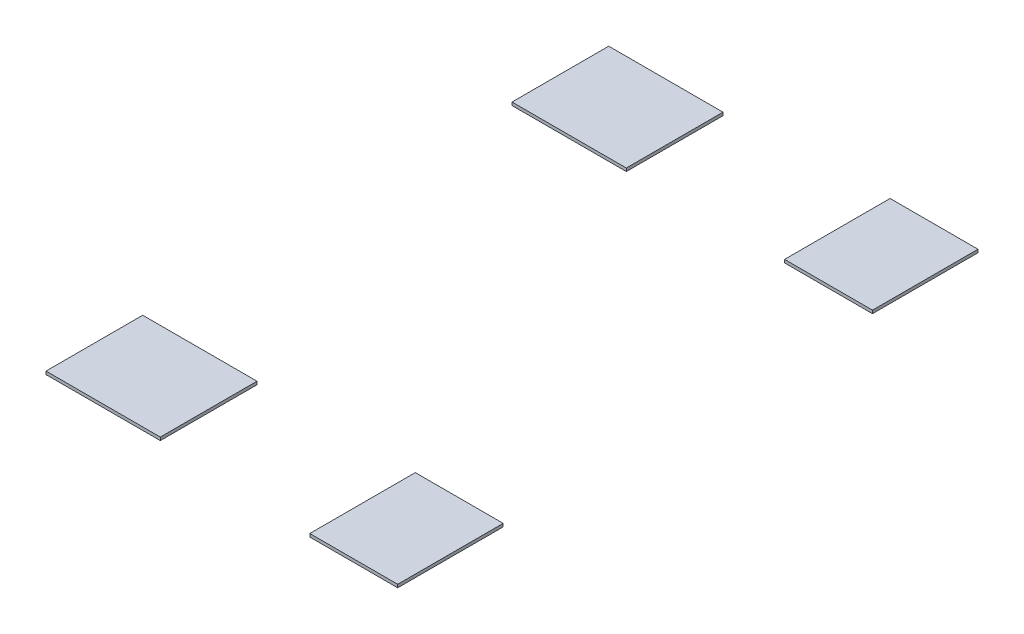
ISO-10303-21;
HEADER;
FILE_DESCRIPTION(('STEP AP214'),'2;1');
FILE_NAME('part.step','',(''),(''),'','','');
FILE_SCHEMA(('AUTOMOTIVE_DESIGN { 1 0 10303 214 1 1 1 1 }'));
ENDSEC;
DATA;
#1=APPLICATION_CONTEXT('core data for automotive mechanical design processes');
#2=APPLICATION_PROTOCOL_DEFINITION('international standard','automotive_design',2000,#1);
#3=PRODUCT_CONTEXT('',#1,'mechanical');
#4=PRODUCT('Part','Part','',(#3));
#5=PRODUCT_RELATED_PRODUCT_CATEGORY('part','',(#4));
#6=PRODUCT_DEFINITION_FORMATION('','',#4);
#7=PRODUCT_DEFINITION_CONTEXT('part definition',#1,'design');
#8=PRODUCT_DEFINITION('design','',#6,#7);
#9=PRODUCT_DEFINITION_SHAPE('','',#8);
#10=(LENGTH_UNIT() NAMED_UNIT(*) SI_UNIT(.MILLI.,.METRE.));
#11=(NAMED_UNIT(*) PLANE_ANGLE_UNIT() SI_UNIT($,.RADIAN.));
#12=(NAMED_UNIT(*) SI_UNIT($,.STERADIAN.) SOLID_ANGLE_UNIT());
#13=UNCERTAINTY_MEASURE_WITH_UNIT(LENGTH_MEASURE(1.E-05),#10,'distance_accuracy_value','');
#14=(GEOMETRIC_REPRESENTATION_CONTEXT(3) GLOBAL_UNCERTAINTY_ASSIGNED_CONTEXT((#13)) GLOBAL_UNIT_ASSIGNED_CONTEXT((#10,
#11,#12)) REPRESENTATION_CONTEXT('',''));
#15=CARTESIAN_POINT('',(0.,0.,0.));
#16=DIRECTION('',(0.,0.,1.));
#17=DIRECTION('',(1.,0.,0.));
#18=AXIS2_PLACEMENT_3D('',#15,#16,#17);
#19=CARTESIAN_POINT('',(-0.35,0.035,2.1));
#20=DIRECTION('',(-1.,0.,0.));
#21=DIRECTION('',(0.,0.,1.));
#22=AXIS2_PLACEMENT_3D('',#19,#20,#21);
#23=PLANE('',#22);
#24=DIRECTION('',(0.,0.,-1.));
#25=VECTOR('',#24,1.);
#26=CARTESIAN_POINT('',(-0.35,0.,2.1));
#27=LINE('',#26,#25);
#28=CARTESIAN_POINT('',(-0.35,0.,3.2));
#29=VERTEX_POINT('',#28);
#30=CARTESIAN_POINT('',(-0.35,0.,2.1));
#31=VERTEX_POINT('',#30);
#32=EDGE_CURVE('E106',#29,#31,#27,.T.);
#33=ORIENTED_EDGE('',*,*,#32,.T.);
#34=DIRECTION('',(0.,-1.,0.));
#35=VECTOR('',#34,1.);
#36=CARTESIAN_POINT('',(-0.35,0.035,2.1));
#37=LINE('',#36,#35);
#38=CARTESIAN_POINT('',(-0.35,0.035,2.1));
#39=VERTEX_POINT('',#38);
#40=EDGE_CURVE('E12',#39,#31,#37,.T.);
#41=ORIENTED_EDGE('',*,*,#40,.F.);
#42=DIRECTION('',(0.,0.,-1.));
#43=VECTOR('',#42,1.);
#44=CARTESIAN_POINT('',(-0.35,0.035,2.1));
#45=LINE('',#44,#43);
#46=CARTESIAN_POINT('',(-0.35,0.035,3.2));
#47=VERTEX_POINT('',#46);
#48=EDGE_CURVE('E94',#47,#39,#45,.T.);
#49=ORIENTED_EDGE('',*,*,#48,.F.);
#50=DIRECTION('',(0.,-1.,0.));
#51=VECTOR('',#50,1.);
#52=CARTESIAN_POINT('',(-0.35,0.035,3.2));
#53=LINE('',#52,#51);
#54=EDGE_CURVE('E102',#47,#29,#53,.T.);
#55=ORIENTED_EDGE('',*,*,#54,.T.);
#56=EDGE_LOOP('',(#33,#41,#49,#55));
#57=FACE_BOUND('',#56,.T.);
#58=ADVANCED_FACE('F43',(#57),#23,.F.);
#59=CARTESIAN_POINT('',(-0.35,0.035,2.1));
#60=DIRECTION('',(0.,0.,1.));
#61=DIRECTION('',(1.,0.,0.));
#62=AXIS2_PLACEMENT_3D('',#59,#60,#61);
#63=PLANE('',#62);
#64=DIRECTION('',(-1.,0.,0.));
#65=VECTOR('',#64,1.);
#66=CARTESIAN_POINT('',(-0.35,0.,2.1));
#67=LINE('',#66,#65);
#68=CARTESIAN_POINT('',(-1.65,0.,2.1));
#69=VERTEX_POINT('',#68);
#70=EDGE_CURVE('E98',#31,#69,#67,.T.);
#71=ORIENTED_EDGE('',*,*,#70,.T.);
#72=DIRECTION('',(0.,-1.,0.));
#73=VECTOR('',#72,1.);
#74=CARTESIAN_POINT('',(-1.65,0.035,2.1));
#75=LINE('',#74,#73);
#76=CARTESIAN_POINT('',(-1.65,0.035,2.1));
#77=VERTEX_POINT('',#76);
#78=EDGE_CURVE('E51',#77,#69,#75,.T.);
#79=ORIENTED_EDGE('',*,*,#78,.F.);
#80=DIRECTION('',(-1.,0.,0.));
#81=VECTOR('',#80,1.);
#82=CARTESIAN_POINT('',(-0.35,0.035,2.1));
#83=LINE('',#82,#81);
#84=EDGE_CURVE('E89',#39,#77,#83,.T.);
#85=ORIENTED_EDGE('',*,*,#84,.F.);
#86=ORIENTED_EDGE('',*,*,#40,.T.);
#87=EDGE_LOOP('',(#71,#79,#85,#86));
#88=FACE_BOUND('',#87,.T.);
#89=ADVANCED_FACE('F97',(#88),#63,.F.);
#90=CARTESIAN_POINT('',(-1.65,0.035,2.1));
#91=DIRECTION('',(1.,0.,0.));
#92=DIRECTION('',(0.,0.,-1.));
#93=AXIS2_PLACEMENT_3D('',#90,#91,#92);
#94=PLANE('',#93);
#95=DIRECTION('',(0.,0.,1.));
#96=VECTOR('',#95,1.);
#97=CARTESIAN_POINT('',(-1.65,0.,2.1));
#98=LINE('',#97,#96);
#99=CARTESIAN_POINT('',(-1.65,0.,3.2));
#100=VERTEX_POINT('',#99);
#101=EDGE_CURVE('E76',#69,#100,#98,.T.);
#102=ORIENTED_EDGE('',*,*,#101,.T.);
#103=DIRECTION('',(0.,-1.,0.));
#104=VECTOR('',#103,1.);
#105=CARTESIAN_POINT('',(-1.65,0.035,3.2));
#106=LINE('',#105,#104);
#107=CARTESIAN_POINT('',(-1.65,0.035,3.2));
#108=VERTEX_POINT('',#107);
#109=EDGE_CURVE('E99',#108,#100,#106,.T.);
#110=ORIENTED_EDGE('',*,*,#109,.F.);
#111=DIRECTION('',(0.,0.,1.));
#112=VECTOR('',#111,1.);
#113=CARTESIAN_POINT('',(-1.65,0.035,2.1));
#114=LINE('',#113,#112);
#115=EDGE_CURVE('E92',#77,#108,#114,.T.);
#116=ORIENTED_EDGE('',*,*,#115,.F.);
#117=ORIENTED_EDGE('',*,*,#78,.T.);
#118=EDGE_LOOP('',(#102,#110,#116,#117));
#119=FACE_BOUND('',#118,.T.);
#120=ADVANCED_FACE('F100',(#119),#94,.F.);
#121=CARTESIAN_POINT('',(-0.35,0.035,3.2));
#122=DIRECTION('',(0.,0.,-1.));
#123=DIRECTION('',(-1.,0.,0.));
#124=AXIS2_PLACEMENT_3D('',#121,#122,#123);
#125=PLANE('',#124);
#126=DIRECTION('',(1.,0.,0.));
#127=VECTOR('',#126,1.);
#128=CARTESIAN_POINT('',(-0.35,0.,3.2));
#129=LINE('',#128,#127);
#130=EDGE_CURVE('E82',#100,#29,#129,.T.);
#131=ORIENTED_EDGE('',*,*,#130,.T.);
#132=ORIENTED_EDGE('',*,*,#54,.F.);
#133=DIRECTION('',(1.,0.,0.));
#134=VECTOR('',#133,1.);
#135=CARTESIAN_POINT('',(-0.35,0.035,3.2));
#136=LINE('',#135,#134);
#137=EDGE_CURVE('E59',#108,#47,#136,.T.);
#138=ORIENTED_EDGE('',*,*,#137,.F.);
#139=ORIENTED_EDGE('',*,*,#109,.T.);
#140=EDGE_LOOP('',(#131,#132,#138,#139));
#141=FACE_BOUND('',#140,.T.);
#142=ADVANCED_FACE('F113',(#141),#125,.F.);
#143=CARTESIAN_POINT('',(0.,0.035,0.));
#144=DIRECTION('',(0.,-1.,0.));
#145=DIRECTION('',(0.,0.,-1.));
#146=AXIS2_PLACEMENT_3D('',#143,#144,#145);
#147=PLANE('',#146);
#148=ORIENTED_EDGE('',*,*,#48,.T.);
#149=ORIENTED_EDGE('',*,*,#84,.T.);
#150=ORIENTED_EDGE('',*,*,#115,.T.);
#151=ORIENTED_EDGE('',*,*,#137,.T.);
#152=EDGE_LOOP('',(#148,#149,#150,#151));
#153=FACE_BOUND('',#152,.T.);
#154=ADVANCED_FACE('F90',(#153),#147,.F.);
#155=CARTESIAN_POINT('',(0.,0.,0.));
#156=DIRECTION('',(0.,-1.,0.));
#157=DIRECTION('',(0.,0.,-1.));
#158=AXIS2_PLACEMENT_3D('',#155,#156,#157);
#159=PLANE('',#158);
#160=ORIENTED_EDGE('',*,*,#32,.F.);
#161=ORIENTED_EDGE('',*,*,#130,.F.);
#162=ORIENTED_EDGE('',*,*,#101,.F.);
#163=ORIENTED_EDGE('',*,*,#70,.F.);
#164=EDGE_LOOP('',(#160,#161,#162,#163));
#165=FACE_BOUND('',#164,.T.);
#166=ADVANCED_FACE('F116',(#165),#159,.T.);
#167=CLOSED_SHELL('',(#58,#89,#120,#142,#154,#166));
#168=MANIFOLD_SOLID_BREP('B2',#167);
#169=CARTESIAN_POINT('',(1.45,0.035,3.3));
#170=DIRECTION('',(0.,0.,-1.));
#171=DIRECTION('',(-1.,0.,0.));
#172=AXIS2_PLACEMENT_3D('',#169,#170,#171);
#173=PLANE('',#172);
#174=DIRECTION('',(1.,0.,0.));
#175=VECTOR('',#174,1.);
#176=CARTESIAN_POINT('',(1.45,0.,3.3));
#177=LINE('',#176,#175);
#178=CARTESIAN_POINT('',(1.45,0.,3.3));
#179=VERTEX_POINT('',#178);
#180=CARTESIAN_POINT('',(2.45,0.,3.3));
#181=VERTEX_POINT('',#180);
#182=EDGE_CURVE('E239',#179,#181,#177,.T.);
#183=ORIENTED_EDGE('',*,*,#182,.T.);
#184=DIRECTION('',(0.,-1.,0.));
#185=VECTOR('',#184,1.);
#186=CARTESIAN_POINT('',(2.45,0.035,3.3));
#187=LINE('',#186,#185);
#188=CARTESIAN_POINT('',(2.45,0.035,3.3));
#189=VERTEX_POINT('',#188);
#190=EDGE_CURVE('E41',#189,#181,#187,.T.);
#191=ORIENTED_EDGE('',*,*,#190,.F.);
#192=DIRECTION('',(1.,0.,0.));
#193=VECTOR('',#192,1.);
#194=CARTESIAN_POINT('',(1.45,0.035,3.3));
#195=LINE('',#194,#193);
#196=CARTESIAN_POINT('',(1.45,0.035,3.3));
#197=VERTEX_POINT('',#196);
#198=EDGE_CURVE('E227',#197,#189,#195,.T.);
#199=ORIENTED_EDGE('',*,*,#198,.F.);
#200=DIRECTION('',(0.,-1.,0.));
#201=VECTOR('',#200,1.);
#202=CARTESIAN_POINT('',(1.45,0.035,3.3));
#203=LINE('',#202,#201);
#204=EDGE_CURVE('E235',#197,#179,#203,.T.);
#205=ORIENTED_EDGE('',*,*,#204,.T.);
#206=EDGE_LOOP('',(#183,#191,#199,#205));
#207=FACE_BOUND('',#206,.T.);
#208=ADVANCED_FACE('F176',(#207),#173,.F.);
#209=CARTESIAN_POINT('',(2.45,0.035,3.3));
#210=DIRECTION('',(-1.,0.,0.));
#211=DIRECTION('',(0.,0.,1.));
#212=AXIS2_PLACEMENT_3D('',#209,#210,#211);
#213=PLANE('',#212);
#214=DIRECTION('',(0.,0.,-1.));
#215=VECTOR('',#214,1.);
#216=CARTESIAN_POINT('',(2.45,0.,3.3));
#217=LINE('',#216,#215);
#218=CARTESIAN_POINT('',(2.45,0.,2.1));
#219=VERTEX_POINT('',#218);
#220=EDGE_CURVE('E231',#181,#219,#217,.T.);
#221=ORIENTED_EDGE('',*,*,#220,.T.);
#222=DIRECTION('',(0.,-1.,0.));
#223=VECTOR('',#222,1.);
#224=CARTESIAN_POINT('',(2.45,0.035,2.1));
#225=LINE('',#224,#223);
#226=CARTESIAN_POINT('',(2.45,0.035,2.1));
#227=VERTEX_POINT('',#226);
#228=EDGE_CURVE('E184',#227,#219,#225,.T.);
#229=ORIENTED_EDGE('',*,*,#228,.F.);
#230=DIRECTION('',(0.,0.,-1.));
#231=VECTOR('',#230,1.);
#232=CARTESIAN_POINT('',(2.45,0.035,3.3));
#233=LINE('',#232,#231);
#234=EDGE_CURVE('E222',#189,#227,#233,.T.);
#235=ORIENTED_EDGE('',*,*,#234,.F.);
#236=ORIENTED_EDGE('',*,*,#190,.T.);
#237=EDGE_LOOP('',(#221,#229,#235,#236));
#238=FACE_BOUND('',#237,.T.);
#239=ADVANCED_FACE('F230',(#238),#213,.F.);
#240=CARTESIAN_POINT('',(1.45,0.035,2.1));
#241=DIRECTION('',(0.,0.,1.));
#242=DIRECTION('',(1.,0.,0.));
#243=AXIS2_PLACEMENT_3D('',#240,#241,#242);
#244=PLANE('',#243);
#245=DIRECTION('',(-1.,0.,0.));
#246=VECTOR('',#245,1.);
#247=CARTESIAN_POINT('',(1.45,0.,2.1));
#248=LINE('',#247,#246);
#249=CARTESIAN_POINT('',(1.45,0.,2.1));
#250=VERTEX_POINT('',#249);
#251=EDGE_CURVE('E209',#219,#250,#248,.T.);
#252=ORIENTED_EDGE('',*,*,#251,.T.);
#253=DIRECTION('',(0.,-1.,0.));
#254=VECTOR('',#253,1.);
#255=CARTESIAN_POINT('',(1.45,0.035,2.1));
#256=LINE('',#255,#254);
#257=CARTESIAN_POINT('',(1.45,0.035,2.1));
#258=VERTEX_POINT('',#257);
#259=EDGE_CURVE('E232',#258,#250,#256,.T.);
#260=ORIENTED_EDGE('',*,*,#259,.F.);
#261=DIRECTION('',(-1.,0.,0.));
#262=VECTOR('',#261,1.);
#263=CARTESIAN_POINT('',(1.45,0.035,2.1));
#264=LINE('',#263,#262);
#265=EDGE_CURVE('E225',#227,#258,#264,.T.);
#266=ORIENTED_EDGE('',*,*,#265,.F.);
#267=ORIENTED_EDGE('',*,*,#228,.T.);
#268=EDGE_LOOP('',(#252,#260,#266,#267));
#269=FACE_BOUND('',#268,.T.);
#270=ADVANCED_FACE('F233',(#269),#244,.F.);
#271=CARTESIAN_POINT('',(1.45,0.035,3.3));
#272=DIRECTION('',(1.,0.,0.));
#273=DIRECTION('',(0.,0.,-1.));
#274=AXIS2_PLACEMENT_3D('',#271,#272,#273);
#275=PLANE('',#274);
#276=DIRECTION('',(0.,0.,1.));
#277=VECTOR('',#276,1.);
#278=CARTESIAN_POINT('',(1.45,0.,3.3));
#279=LINE('',#278,#277);
#280=EDGE_CURVE('E215',#250,#179,#279,.T.);
#281=ORIENTED_EDGE('',*,*,#280,.T.);
#282=ORIENTED_EDGE('',*,*,#204,.F.);
#283=DIRECTION('',(0.,0.,1.));
#284=VECTOR('',#283,1.);
#285=CARTESIAN_POINT('',(1.45,0.035,3.3));
#286=LINE('',#285,#284);
#287=EDGE_CURVE('E192',#258,#197,#286,.T.);
#288=ORIENTED_EDGE('',*,*,#287,.F.);
#289=ORIENTED_EDGE('',*,*,#259,.T.);
#290=EDGE_LOOP('',(#281,#282,#288,#289));
#291=FACE_BOUND('',#290,.T.);
#292=ADVANCED_FACE('F246',(#291),#275,.F.);
#293=CARTESIAN_POINT('',(0.,0.035,0.));
#294=DIRECTION('',(0.,1.,0.));
#295=DIRECTION('',(0.,0.,1.));
#296=AXIS2_PLACEMENT_3D('',#293,#294,#295);
#297=PLANE('',#296);
#298=ORIENTED_EDGE('',*,*,#198,.T.);
#299=ORIENTED_EDGE('',*,*,#234,.T.);
#300=ORIENTED_EDGE('',*,*,#265,.T.);
#301=ORIENTED_EDGE('',*,*,#287,.T.);
#302=EDGE_LOOP('',(#298,#299,#300,#301));
#303=FACE_BOUND('',#302,.T.);
#304=ADVANCED_FACE('F223',(#303),#297,.T.);
#305=CARTESIAN_POINT('',(0.,0.,0.));
#306=DIRECTION('',(0.,1.,0.));
#307=DIRECTION('',(0.,0.,1.));
#308=AXIS2_PLACEMENT_3D('',#305,#306,#307);
#309=PLANE('',#308);
#310=ORIENTED_EDGE('',*,*,#182,.F.);
#311=ORIENTED_EDGE('',*,*,#280,.F.);
#312=ORIENTED_EDGE('',*,*,#251,.F.);
#313=ORIENTED_EDGE('',*,*,#220,.F.);
#314=EDGE_LOOP('',(#310,#311,#312,#313));
#315=FACE_BOUND('',#314,.T.);
#316=ADVANCED_FACE('F249',(#315),#309,.F.);
#317=CLOSED_SHELL('',(#208,#239,#270,#292,#304,#316));
#318=MANIFOLD_SOLID_BREP('B6',#317);
#319=CARTESIAN_POINT('',(-0.35,0.035,-2.1));
#320=DIRECTION('',(-1.,0.,0.));
#321=DIRECTION('',(0.,0.,1.));
#322=AXIS2_PLACEMENT_3D('',#319,#320,#321);
#323=PLANE('',#322);
#324=DIRECTION('',(0.,0.,-1.));
#325=VECTOR('',#324,1.);
#326=CARTESIAN_POINT('',(-0.35,0.,-2.1));
#327=LINE('',#326,#325);
#328=CARTESIAN_POINT('',(-0.35,0.,-2.1));
#329=VERTEX_POINT('',#328);
#330=CARTESIAN_POINT('',(-0.35,0.,-3.2));
#331=VERTEX_POINT('',#330);
#332=EDGE_CURVE('E371',#329,#331,#327,.T.);
#333=ORIENTED_EDGE('',*,*,#332,.T.);
#334=DIRECTION('',(0.,-1.,0.));
#335=VECTOR('',#334,1.);
#336=CARTESIAN_POINT('',(-0.35,0.035,-3.2));
#337=LINE('',#336,#335);
#338=CARTESIAN_POINT('',(-0.35,0.035,-3.2));
#339=VERTEX_POINT('',#338);
#340=EDGE_CURVE('E174',#339,#331,#337,.T.);
#341=ORIENTED_EDGE('',*,*,#340,.F.);
#342=DIRECTION('',(0.,0.,-1.));
#343=VECTOR('',#342,1.);
#344=CARTESIAN_POINT('',(-0.35,0.035,-2.1));
#345=LINE('',#344,#343);
#346=CARTESIAN_POINT('',(-0.35,0.035,-2.1));
#347=VERTEX_POINT('',#346);
#348=EDGE_CURVE('E359',#347,#339,#345,.T.);
#349=ORIENTED_EDGE('',*,*,#348,.F.);
#350=DIRECTION('',(0.,-1.,0.));
#351=VECTOR('',#350,1.);
#352=CARTESIAN_POINT('',(-0.35,0.035,-2.1));
#353=LINE('',#352,#351);
#354=EDGE_CURVE('E367',#347,#329,#353,.T.);
#355=ORIENTED_EDGE('',*,*,#354,.T.);
#356=EDGE_LOOP('',(#333,#341,#349,#355));
#357=FACE_BOUND('',#356,.T.);
#358=ADVANCED_FACE('F308',(#357),#323,.F.);
#359=CARTESIAN_POINT('',(-0.35,0.035,-3.2));
#360=DIRECTION('',(0.,0.,1.));
#361=DIRECTION('',(1.,0.,0.));
#362=AXIS2_PLACEMENT_3D('',#359,#360,#361);
#363=PLANE('',#362);
#364=DIRECTION('',(-1.,0.,0.));
#365=VECTOR('',#364,1.);
#366=CARTESIAN_POINT('',(-0.35,0.,-3.2));
#367=LINE('',#366,#365);
#368=CARTESIAN_POINT('',(-1.65,0.,-3.2));
#369=VERTEX_POINT('',#368);
#370=EDGE_CURVE('E363',#331,#369,#367,.T.);
#371=ORIENTED_EDGE('',*,*,#370,.T.);
#372=DIRECTION('',(0.,-1.,0.));
#373=VECTOR('',#372,1.);
#374=CARTESIAN_POINT('',(-1.65,0.035,-3.2));
#375=LINE('',#374,#373);
#376=CARTESIAN_POINT('',(-1.65,0.035,-3.2));
#377=VERTEX_POINT('',#376);
#378=EDGE_CURVE('E316',#377,#369,#375,.T.);
#379=ORIENTED_EDGE('',*,*,#378,.F.);
#380=DIRECTION('',(-1.,0.,0.));
#381=VECTOR('',#380,1.);
#382=CARTESIAN_POINT('',(-0.35,0.035,-3.2));
#383=LINE('',#382,#381);
#384=EDGE_CURVE('E354',#339,#377,#383,.T.);
#385=ORIENTED_EDGE('',*,*,#384,.F.);
#386=ORIENTED_EDGE('',*,*,#340,.T.);
#387=EDGE_LOOP('',(#371,#379,#385,#386));
#388=FACE_BOUND('',#387,.T.);
#389=ADVANCED_FACE('F362',(#388),#363,.F.);
#390=CARTESIAN_POINT('',(-1.65,0.035,-2.1));
#391=DIRECTION('',(1.,0.,0.));
#392=DIRECTION('',(0.,0.,-1.));
#393=AXIS2_PLACEMENT_3D('',#390,#391,#392);
#394=PLANE('',#393);
#395=DIRECTION('',(0.,0.,1.));
#396=VECTOR('',#395,1.);
#397=CARTESIAN_POINT('',(-1.65,0.,-2.1));
#398=LINE('',#397,#396);
#399=CARTESIAN_POINT('',(-1.65,0.,-2.1));
#400=VERTEX_POINT('',#399);
#401=EDGE_CURVE('E341',#369,#400,#398,.T.);
#402=ORIENTED_EDGE('',*,*,#401,.T.);
#403=DIRECTION('',(0.,-1.,0.));
#404=VECTOR('',#403,1.);
#405=CARTESIAN_POINT('',(-1.65,0.035,-2.1));
#406=LINE('',#405,#404);
#407=CARTESIAN_POINT('',(-1.65,0.035,-2.1));
#408=VERTEX_POINT('',#407);
#409=EDGE_CURVE('E364',#408,#400,#406,.T.);
#410=ORIENTED_EDGE('',*,*,#409,.F.);
#411=DIRECTION('',(0.,0.,1.));
#412=VECTOR('',#411,1.);
#413=CARTESIAN_POINT('',(-1.65,0.035,-2.1));
#414=LINE('',#413,#412);
#415=EDGE_CURVE('E357',#377,#408,#414,.T.);
#416=ORIENTED_EDGE('',*,*,#415,.F.);
#417=ORIENTED_EDGE('',*,*,#378,.T.);
#418=EDGE_LOOP('',(#402,#410,#416,#417));
#419=FACE_BOUND('',#418,.T.);
#420=ADVANCED_FACE('F365',(#419),#394,.F.);
#421=CARTESIAN_POINT('',(-0.35,0.035,-2.1));
#422=DIRECTION('',(0.,0.,-1.));
#423=DIRECTION('',(-1.,0.,0.));
#424=AXIS2_PLACEMENT_3D('',#421,#422,#423);
#425=PLANE('',#424);
#426=DIRECTION('',(1.,0.,0.));
#427=VECTOR('',#426,1.);
#428=CARTESIAN_POINT('',(-0.35,0.,-2.1));
#429=LINE('',#428,#427);
#430=EDGE_CURVE('E347',#400,#329,#429,.T.);
#431=ORIENTED_EDGE('',*,*,#430,.T.);
#432=ORIENTED_EDGE('',*,*,#354,.F.);
#433=DIRECTION('',(1.,0.,0.));
#434=VECTOR('',#433,1.);
#435=CARTESIAN_POINT('',(-0.35,0.035,-2.1));
#436=LINE('',#435,#434);
#437=EDGE_CURVE('E324',#408,#347,#436,.T.);
#438=ORIENTED_EDGE('',*,*,#437,.F.);
#439=ORIENTED_EDGE('',*,*,#409,.T.);
#440=EDGE_LOOP('',(#431,#432,#438,#439));
#441=FACE_BOUND('',#440,.T.);
#442=ADVANCED_FACE('F378',(#441),#425,.F.);
#443=CARTESIAN_POINT('',(0.,0.035,0.));
#444=DIRECTION('',(0.,1.,0.));
#445=DIRECTION('',(0.,0.,1.));
#446=AXIS2_PLACEMENT_3D('',#443,#444,#445);
#447=PLANE('',#446);
#448=ORIENTED_EDGE('',*,*,#348,.T.);
#449=ORIENTED_EDGE('',*,*,#384,.T.);
#450=ORIENTED_EDGE('',*,*,#415,.T.);
#451=ORIENTED_EDGE('',*,*,#437,.T.);
#452=EDGE_LOOP('',(#448,#449,#450,#451));
#453=FACE_BOUND('',#452,.T.);
#454=ADVANCED_FACE('F355',(#453),#447,.T.);
#455=CARTESIAN_POINT('',(0.,0.,0.));
#456=DIRECTION('',(0.,1.,0.));
#457=DIRECTION('',(0.,0.,1.));
#458=AXIS2_PLACEMENT_3D('',#455,#456,#457);
#459=PLANE('',#458);
#460=ORIENTED_EDGE('',*,*,#332,.F.);
#461=ORIENTED_EDGE('',*,*,#430,.F.);
#462=ORIENTED_EDGE('',*,*,#401,.F.);
#463=ORIENTED_EDGE('',*,*,#370,.F.);
#464=EDGE_LOOP('',(#460,#461,#462,#463));
#465=FACE_BOUND('',#464,.T.);
#466=ADVANCED_FACE('F381',(#465),#459,.F.);
#467=CLOSED_SHELL('',(#358,#389,#420,#442,#454,#466));
#468=MANIFOLD_SOLID_BREP('B35',#467);
#469=CARTESIAN_POINT('',(1.45,0.035,-3.3));
#470=DIRECTION('',(1.,0.,0.));
#471=DIRECTION('',(0.,0.,-1.));
#472=AXIS2_PLACEMENT_3D('',#469,#470,#471);
#473=PLANE('',#472);
#474=DIRECTION('',(0.,0.,1.));
#475=VECTOR('',#474,1.);
#476=CARTESIAN_POINT('',(1.45,0.,-3.3));
#477=LINE('',#476,#475);
#478=CARTESIAN_POINT('',(1.45,0.,-3.3));
#479=VERTEX_POINT('',#478);
#480=CARTESIAN_POINT('',(1.45,0.,-2.1));
#481=VERTEX_POINT('',#480);
#482=EDGE_CURVE('E494',#479,#481,#477,.T.);
#483=ORIENTED_EDGE('',*,*,#482,.T.);
#484=DIRECTION('',(0.,-1.,0.));
#485=VECTOR('',#484,1.);
#486=CARTESIAN_POINT('',(1.45,0.035,-2.1));
#487=LINE('',#486,#485);
#488=CARTESIAN_POINT('',(1.45,0.035,-2.1));
#489=VERTEX_POINT('',#488);
#490=EDGE_CURVE('E306',#489,#481,#487,.T.);
#491=ORIENTED_EDGE('',*,*,#490,.F.);
#492=DIRECTION('',(0.,0.,1.));
#493=VECTOR('',#492,1.);
#494=CARTESIAN_POINT('',(1.45,0.035,-3.3));
#495=LINE('',#494,#493);
#496=CARTESIAN_POINT('',(1.45,0.035,-3.3));
#497=VERTEX_POINT('',#496);
#498=EDGE_CURVE('E482',#497,#489,#495,.T.);
#499=ORIENTED_EDGE('',*,*,#498,.F.);
#500=DIRECTION('',(0.,-1.,0.));
#501=VECTOR('',#500,1.);
#502=CARTESIAN_POINT('',(1.45,0.035,-3.3));
#503=LINE('',#502,#501);
#504=EDGE_CURVE('E490',#497,#479,#503,.T.);
#505=ORIENTED_EDGE('',*,*,#504,.T.);
#506=EDGE_LOOP('',(#483,#491,#499,#505));
#507=FACE_BOUND('',#506,.T.);
#508=ADVANCED_FACE('F431',(#507),#473,.F.);
#509=CARTESIAN_POINT('',(1.45,0.035,-2.1));
#510=DIRECTION('',(0.,0.,-1.));
#511=DIRECTION('',(-1.,0.,0.));
#512=AXIS2_PLACEMENT_3D('',#509,#510,#511);
#513=PLANE('',#512);
#514=DIRECTION('',(1.,0.,0.));
#515=VECTOR('',#514,1.);
#516=CARTESIAN_POINT('',(1.45,0.,-2.1));
#517=LINE('',#516,#515);
#518=CARTESIAN_POINT('',(2.45,0.,-2.1));
#519=VERTEX_POINT('',#518);
#520=EDGE_CURVE('E486',#481,#519,#517,.T.);
#521=ORIENTED_EDGE('',*,*,#520,.T.);
#522=DIRECTION('',(0.,-1.,0.));
#523=VECTOR('',#522,1.);
#524=CARTESIAN_POINT('',(2.45,0.035,-2.1));
#525=LINE('',#524,#523);
#526=CARTESIAN_POINT('',(2.45,0.035,-2.1));
#527=VERTEX_POINT('',#526);
#528=EDGE_CURVE('E439',#527,#519,#525,.T.);
#529=ORIENTED_EDGE('',*,*,#528,.F.);
#530=DIRECTION('',(1.,0.,0.));
#531=VECTOR('',#530,1.);
#532=CARTESIAN_POINT('',(1.45,0.035,-2.1));
#533=LINE('',#532,#531);
#534=EDGE_CURVE('E477',#489,#527,#533,.T.);
#535=ORIENTED_EDGE('',*,*,#534,.F.);
#536=ORIENTED_EDGE('',*,*,#490,.T.);
#537=EDGE_LOOP('',(#521,#529,#535,#536));
#538=FACE_BOUND('',#537,.T.);
#539=ADVANCED_FACE('F485',(#538),#513,.F.);
#540=CARTESIAN_POINT('',(2.45,0.035,-3.3));
#541=DIRECTION('',(-1.,0.,0.));
#542=DIRECTION('',(0.,0.,1.));
#543=AXIS2_PLACEMENT_3D('',#540,#541,#542);
#544=PLANE('',#543);
#545=DIRECTION('',(0.,0.,-1.));
#546=VECTOR('',#545,1.);
#547=CARTESIAN_POINT('',(2.45,0.,-3.3));
#548=LINE('',#547,#546);
#549=CARTESIAN_POINT('',(2.45,0.,-3.3));
#550=VERTEX_POINT('',#549);
#551=EDGE_CURVE('E464',#519,#550,#548,.T.);
#552=ORIENTED_EDGE('',*,*,#551,.T.);
#553=DIRECTION('',(0.,-1.,0.));
#554=VECTOR('',#553,1.);
#555=CARTESIAN_POINT('',(2.45,0.035,-3.3));
#556=LINE('',#555,#554);
#557=CARTESIAN_POINT('',(2.45,0.035,-3.3));
#558=VERTEX_POINT('',#557);
#559=EDGE_CURVE('E487',#558,#550,#556,.T.);
#560=ORIENTED_EDGE('',*,*,#559,.F.);
#561=DIRECTION('',(0.,0.,-1.));
#562=VECTOR('',#561,1.);
#563=CARTESIAN_POINT('',(2.45,0.035,-3.3));
#564=LINE('',#563,#562);
#565=EDGE_CURVE('E480',#527,#558,#564,.T.);
#566=ORIENTED_EDGE('',*,*,#565,.F.);
#567=ORIENTED_EDGE('',*,*,#528,.T.);
#568=EDGE_LOOP('',(#552,#560,#566,#567));
#569=FACE_BOUND('',#568,.T.);
#570=ADVANCED_FACE('F488',(#569),#544,.F.);
#571=CARTESIAN_POINT('',(1.45,0.035,-3.3));
#572=DIRECTION('',(0.,0.,1.));
#573=DIRECTION('',(1.,0.,0.));
#574=AXIS2_PLACEMENT_3D('',#571,#572,#573);
#575=PLANE('',#574);
#576=DIRECTION('',(-1.,0.,0.));
#577=VECTOR('',#576,1.);
#578=CARTESIAN_POINT('',(1.45,0.,-3.3));
#579=LINE('',#578,#577);
#580=EDGE_CURVE('E470',#550,#479,#579,.T.);
#581=ORIENTED_EDGE('',*,*,#580,.T.);
#582=ORIENTED_EDGE('',*,*,#504,.F.);
#583=DIRECTION('',(-1.,0.,0.));
#584=VECTOR('',#583,1.);
#585=CARTESIAN_POINT('',(1.45,0.035,-3.3));
#586=LINE('',#585,#584);
#587=EDGE_CURVE('E447',#558,#497,#586,.T.);
#588=ORIENTED_EDGE('',*,*,#587,.F.);
#589=ORIENTED_EDGE('',*,*,#559,.T.);
#590=EDGE_LOOP('',(#581,#582,#588,#589));
#591=FACE_BOUND('',#590,.T.);
#592=ADVANCED_FACE('F501',(#591),#575,.F.);
#593=CARTESIAN_POINT('',(0.,0.035,0.));
#594=DIRECTION('',(0.,1.,0.));
#595=DIRECTION('',(0.,0.,1.));
#596=AXIS2_PLACEMENT_3D('',#593,#594,#595);
#597=PLANE('',#596);
#598=ORIENTED_EDGE('',*,*,#498,.T.);
#599=ORIENTED_EDGE('',*,*,#534,.T.);
#600=ORIENTED_EDGE('',*,*,#565,.T.);
#601=ORIENTED_EDGE('',*,*,#587,.T.);
#602=EDGE_LOOP('',(#598,#599,#600,#601));
#603=FACE_BOUND('',#602,.T.);
#604=ADVANCED_FACE('F478',(#603),#597,.T.);
#605=CARTESIAN_POINT('',(0.,0.,0.));
#606=DIRECTION('',(0.,1.,0.));
#607=DIRECTION('',(0.,0.,1.));
#608=AXIS2_PLACEMENT_3D('',#605,#606,#607);
#609=PLANE('',#608);
#610=ORIENTED_EDGE('',*,*,#482,.F.);
#611=ORIENTED_EDGE('',*,*,#580,.F.);
#612=ORIENTED_EDGE('',*,*,#551,.F.);
#613=ORIENTED_EDGE('',*,*,#520,.F.);
#614=EDGE_LOOP('',(#610,#611,#612,#613));
#615=FACE_BOUND('',#614,.T.);
#616=ADVANCED_FACE('F504',(#615),#609,.F.);
#617=CLOSED_SHELL('',(#508,#539,#570,#592,#604,#616));
#618=MANIFOLD_SOLID_BREP('B168',#617);
#619=ADVANCED_BREP_SHAPE_REPRESENTATION('',(#18,#168,#318,#468,#618),#14);
#620=SHAPE_DEFINITION_REPRESENTATION(#9,#619);
ENDSEC;
END-ISO-10303-21;
